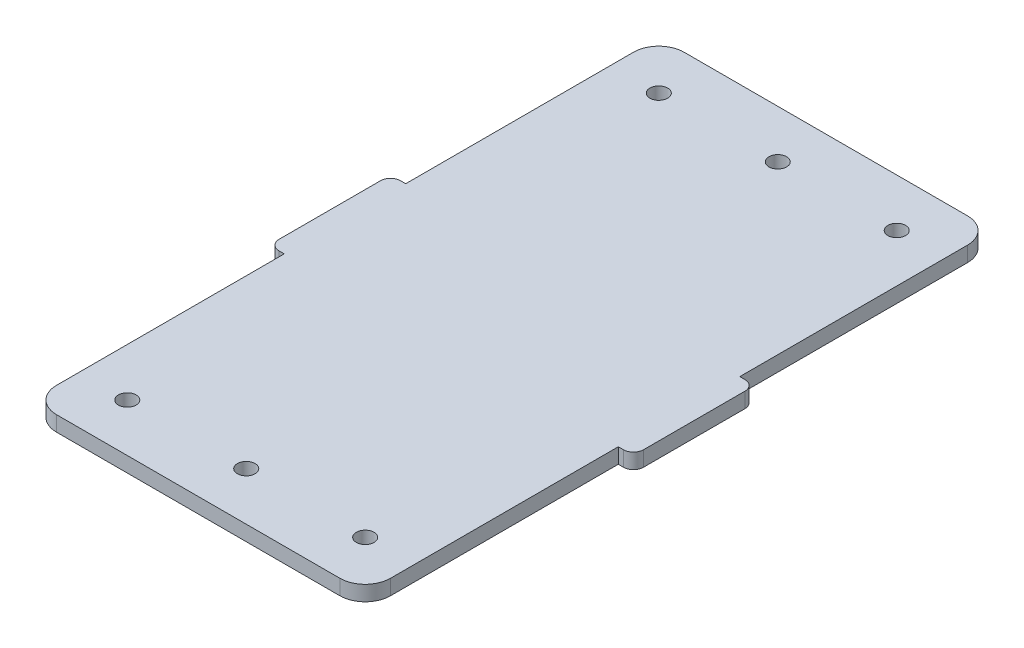
ISO-10303-21;
HEADER;
FILE_DESCRIPTION(('STEP AP214'),'2;1');
FILE_NAME('part.step','',(''),(''),'','','');
FILE_SCHEMA(('AUTOMOTIVE_DESIGN { 1 0 10303 214 1 1 1 1 }'));
ENDSEC;
DATA;
#1=APPLICATION_CONTEXT('core data for automotive mechanical design processes');
#2=APPLICATION_PROTOCOL_DEFINITION('international standard','automotive_design',2000,#1);
#3=PRODUCT_CONTEXT('',#1,'mechanical');
#4=PRODUCT('Part','Part','',(#3));
#5=PRODUCT_RELATED_PRODUCT_CATEGORY('part','',(#4));
#6=PRODUCT_DEFINITION_FORMATION('','',#4);
#7=PRODUCT_DEFINITION_CONTEXT('part definition',#1,'design');
#8=PRODUCT_DEFINITION('design','',#6,#7);
#9=PRODUCT_DEFINITION_SHAPE('','',#8);
#10=(LENGTH_UNIT() NAMED_UNIT(*) SI_UNIT(.MILLI.,.METRE.));
#11=(NAMED_UNIT(*) PLANE_ANGLE_UNIT() SI_UNIT($,.RADIAN.));
#12=(NAMED_UNIT(*) SI_UNIT($,.STERADIAN.) SOLID_ANGLE_UNIT());
#13=UNCERTAINTY_MEASURE_WITH_UNIT(LENGTH_MEASURE(1.E-05),#10,'distance_accuracy_value','');
#14=(GEOMETRIC_REPRESENTATION_CONTEXT(3) GLOBAL_UNCERTAINTY_ASSIGNED_CONTEXT((#13)) GLOBAL_UNIT_ASSIGNED_CONTEXT((#10,
#11,#12)) REPRESENTATION_CONTEXT('',''));
#15=CARTESIAN_POINT('',(0.,0.,0.));
#16=DIRECTION('',(0.,0.,1.));
#17=DIRECTION('',(1.,0.,0.));
#18=AXIS2_PLACEMENT_3D('',#15,#16,#17);
#19=CARTESIAN_POINT('',(36.,3.,-50.));
#20=DIRECTION('',(-1.,0.,0.));
#21=DIRECTION('',(0.,0.,1.));
#22=AXIS2_PLACEMENT_3D('',#19,#20,#21);
#23=PLANE('',#22);
#24=DIRECTION('',(0.,0.,-1.));
#25=VECTOR('',#24,1.);
#26=CARTESIAN_POINT('',(36.,3.,-50.));
#27=LINE('',#26,#25);
#28=CARTESIAN_POINT('',(36.,3.,22.));
#29=VERTEX_POINT('',#28);
#30=CARTESIAN_POINT('',(36.,3.,2.));
#31=VERTEX_POINT('',#30);
#32=EDGE_CURVE('E248',#29,#31,#27,.T.);
#33=ORIENTED_EDGE('',*,*,#32,.F.);
#34=DIRECTION('',(0.,1.,0.));
#35=VECTOR('',#34,1.);
#36=CARTESIAN_POINT('',(36.,3.,22.));
#37=LINE('',#36,#35);
#38=CARTESIAN_POINT('',(36.,0.,22.));
#39=VERTEX_POINT('',#38);
#40=EDGE_CURVE('E313',#29,#39,#37,.F.);
#41=ORIENTED_EDGE('',*,*,#40,.T.);
#42=DIRECTION('',(0.,0.,-1.));
#43=VECTOR('',#42,1.);
#44=CARTESIAN_POINT('',(36.,0.,-50.));
#45=LINE('',#44,#43);
#46=CARTESIAN_POINT('',(36.,0.,2.));
#47=VERTEX_POINT('',#46);
#48=EDGE_CURVE('E247',#39,#47,#45,.T.);
#49=ORIENTED_EDGE('',*,*,#48,.T.);
#50=DIRECTION('',(0.,1.,0.));
#51=VECTOR('',#50,1.);
#52=CARTESIAN_POINT('',(36.,3.,2.));
#53=LINE('',#52,#51);
#54=EDGE_CURVE('E310',#47,#31,#53,.T.);
#55=ORIENTED_EDGE('',*,*,#54,.T.);
#56=EDGE_LOOP('',(#33,#41,#49,#55));
#57=FACE_BOUND('',#56,.T.);
#58=ADVANCED_FACE('F33',(#57),#23,.F.);
#59=CARTESIAN_POINT('',(-36.,3.,-50.));
#60=DIRECTION('',(0.,0.,1.));
#61=DIRECTION('',(1.,0.,0.));
#62=AXIS2_PLACEMENT_3D('',#59,#60,#61);
#63=PLANE('',#62);
#64=DIRECTION('',(-1.,0.,0.));
#65=VECTOR('',#64,1.);
#66=CARTESIAN_POINT('',(-36.,3.,-50.));
#67=LINE('',#66,#65);
#68=CARTESIAN_POINT('',(28.,3.,-50.));
#69=VERTEX_POINT('',#68);
#70=CARTESIAN_POINT('',(-28.,3.,-50.));
#71=VERTEX_POINT('',#70);
#72=EDGE_CURVE('E251',#69,#71,#67,.T.);
#73=ORIENTED_EDGE('',*,*,#72,.F.);
#74=DIRECTION('',(0.,1.,0.));
#75=VECTOR('',#74,1.);
#76=CARTESIAN_POINT('',(28.,3.,-50.));
#77=LINE('',#76,#75);
#78=CARTESIAN_POINT('',(28.,0.,-50.));
#79=VERTEX_POINT('',#78);
#80=EDGE_CURVE('E296',#69,#79,#77,.F.);
#81=ORIENTED_EDGE('',*,*,#80,.T.);
#82=DIRECTION('',(-1.,0.,0.));
#83=VECTOR('',#82,1.);
#84=CARTESIAN_POINT('',(-36.,0.,-50.));
#85=LINE('',#84,#83);
#86=CARTESIAN_POINT('',(-28.,0.,-50.));
#87=VERTEX_POINT('',#86);
#88=EDGE_CURVE('E261',#79,#87,#85,.T.);
#89=ORIENTED_EDGE('',*,*,#88,.T.);
#90=DIRECTION('',(0.,1.,0.));
#91=VECTOR('',#90,1.);
#92=CARTESIAN_POINT('',(-28.,3.,-50.));
#93=LINE('',#92,#91);
#94=EDGE_CURVE('E293',#87,#71,#93,.T.);
#95=ORIENTED_EDGE('',*,*,#94,.T.);
#96=EDGE_LOOP('',(#73,#81,#89,#95));
#97=FACE_BOUND('',#96,.T.);
#98=ADVANCED_FACE('F362',(#97),#63,.F.);
#99=CARTESIAN_POINT('',(-36.,3.,-50.));
#100=DIRECTION('',(1.,0.,0.));
#101=DIRECTION('',(0.,0.,-1.));
#102=AXIS2_PLACEMENT_3D('',#99,#100,#101);
#103=PLANE('',#102);
#104=DIRECTION('',(0.,0.,1.));
#105=VECTOR('',#104,1.);
#106=CARTESIAN_POINT('',(-36.,0.,-50.));
#107=LINE('',#106,#105);
#108=CARTESIAN_POINT('',(-36.,0.,2.));
#109=VERTEX_POINT('',#108);
#110=CARTESIAN_POINT('',(-36.,0.,22.));
#111=VERTEX_POINT('',#110);
#112=EDGE_CURVE('E252',#109,#111,#107,.T.);
#113=ORIENTED_EDGE('',*,*,#112,.T.);
#114=DIRECTION('',(0.,1.,0.));
#115=VECTOR('',#114,1.);
#116=CARTESIAN_POINT('',(-36.,3.,22.));
#117=LINE('',#116,#115);
#118=CARTESIAN_POINT('',(-36.,3.,22.));
#119=VERTEX_POINT('',#118);
#120=EDGE_CURVE('E324',#111,#119,#117,.T.);
#121=ORIENTED_EDGE('',*,*,#120,.T.);
#122=DIRECTION('',(0.,0.,1.));
#123=VECTOR('',#122,1.);
#124=CARTESIAN_POINT('',(-36.,3.,-50.));
#125=LINE('',#124,#123);
#126=CARTESIAN_POINT('',(-36.,3.,2.));
#127=VERTEX_POINT('',#126);
#128=EDGE_CURVE('E255',#127,#119,#125,.T.);
#129=ORIENTED_EDGE('',*,*,#128,.F.);
#130=DIRECTION('',(0.,1.,0.));
#131=VECTOR('',#130,1.);
#132=CARTESIAN_POINT('',(-36.,3.,2.));
#133=LINE('',#132,#131);
#134=EDGE_CURVE('E322',#127,#109,#133,.F.);
#135=ORIENTED_EDGE('',*,*,#134,.T.);
#136=EDGE_LOOP('',(#113,#121,#129,#135));
#137=FACE_BOUND('',#136,.T.);
#138=ADVANCED_FACE('F339',(#137),#103,.F.);
#139=CARTESIAN_POINT('',(0.,3.,0.));
#140=DIRECTION('',(0.,1.,0.));
#141=DIRECTION('',(0.,0.,1.));
#142=AXIS2_PLACEMENT_3D('',#139,#140,#141);
#143=PLANE('',#142);
#144=CARTESIAN_POINT('',(0.,3.,-40.5));
#145=DIRECTION('',(0.,1.,0.));
#146=DIRECTION('',(0.,0.,1.));
#147=AXIS2_PLACEMENT_3D('',#144,#145,#146);
#148=CIRCLE('',#147,1.75);
#149=CARTESIAN_POINT('',(0.,3.,-38.75));
#150=VERTEX_POINT('',#149);
#151=EDGE_CURVE('E685',#150,#150,#148,.T.);
#152=ORIENTED_EDGE('',*,*,#151,.F.);
#153=EDGE_LOOP('',(#152));
#154=FACE_BOUND('',#153,.T.);
#155=CARTESIAN_POINT('',(0.,3.,64.5));
#156=DIRECTION('',(0.,1.,0.));
#157=DIRECTION('',(0.,0.,1.));
#158=AXIS2_PLACEMENT_3D('',#155,#156,#157);
#159=CIRCLE('',#158,1.75);
#160=CARTESIAN_POINT('',(0.,3.,66.25));
#161=VERTEX_POINT('',#160);
#162=EDGE_CURVE('E690',#161,#161,#159,.T.);
#163=ORIENTED_EDGE('',*,*,#162,.F.);
#164=EDGE_LOOP('',(#163));
#165=FACE_BOUND('',#164,.T.);
#166=CARTESIAN_POINT('',(23.5,3.,-40.5));
#167=DIRECTION('',(0.,1.,0.));
#168=DIRECTION('',(0.,0.,1.));
#169=AXIS2_PLACEMENT_3D('',#166,#167,#168);
#170=CIRCLE('',#169,1.75);
#171=CARTESIAN_POINT('',(23.5,3.,-38.75));
#172=VERTEX_POINT('',#171);
#173=EDGE_CURVE('E672',#172,#172,#170,.T.);
#174=ORIENTED_EDGE('',*,*,#173,.F.);
#175=EDGE_LOOP('',(#174));
#176=FACE_BOUND('',#175,.T.);
#177=CARTESIAN_POINT('',(-23.5,3.,64.5));
#178=DIRECTION('',(0.,1.,0.));
#179=DIRECTION('',(0.,0.,1.));
#180=AXIS2_PLACEMENT_3D('',#177,#178,#179);
#181=CIRCLE('',#180,1.75);
#182=CARTESIAN_POINT('',(-23.5,3.,66.25));
#183=VERTEX_POINT('',#182);
#184=EDGE_CURVE('E676',#183,#183,#181,.T.);
#185=ORIENTED_EDGE('',*,*,#184,.F.);
#186=EDGE_LOOP('',(#185));
#187=FACE_BOUND('',#186,.T.);
#188=CARTESIAN_POINT('',(23.5,3.,64.5));
#189=DIRECTION('',(0.,1.,0.));
#190=DIRECTION('',(0.,0.,1.));
#191=AXIS2_PLACEMENT_3D('',#188,#189,#190);
#192=CIRCLE('',#191,1.75);
#193=CARTESIAN_POINT('',(23.5,3.,66.25));
#194=VERTEX_POINT('',#193);
#195=EDGE_CURVE('E681',#194,#194,#192,.T.);
#196=ORIENTED_EDGE('',*,*,#195,.F.);
#197=EDGE_LOOP('',(#196));
#198=FACE_BOUND('',#197,.T.);
#199=CARTESIAN_POINT('',(-23.5,3.,-40.5));
#200=DIRECTION('',(0.,1.,0.));
#201=DIRECTION('',(0.,0.,1.));
#202=AXIS2_PLACEMENT_3D('',#199,#200,#201);
#203=CIRCLE('',#202,1.75);
#204=CARTESIAN_POINT('',(-23.5,3.,-38.75));
#205=VERTEX_POINT('',#204);
#206=EDGE_CURVE('E184',#205,#205,#203,.T.);
#207=ORIENTED_EDGE('',*,*,#206,.F.);
#208=EDGE_LOOP('',(#207));
#209=FACE_BOUND('',#208,.T.);
#210=DIRECTION('',(-1.,0.,0.));
#211=VECTOR('',#210,1.);
#212=CARTESIAN_POINT('',(0.,3.,24.));
#213=LINE('',#212,#211);
#214=CARTESIAN_POINT('',(34.,3.,24.));
#215=VERTEX_POINT('',#214);
#216=CARTESIAN_POINT('',(33.,3.,24.));
#217=VERTEX_POINT('',#216);
#218=EDGE_CURVE('E190',#215,#217,#213,.T.);
#219=ORIENTED_EDGE('',*,*,#218,.F.);
#220=CARTESIAN_POINT('',(34.,3.,22.));
#221=DIRECTION('',(0.,1.,0.));
#222=DIRECTION('',(0.,0.,1.));
#223=AXIS2_PLACEMENT_3D('',#220,#221,#222);
#224=CIRCLE('',#223,2.);
#225=EDGE_CURVE('E308',#215,#29,#224,.T.);
#226=ORIENTED_EDGE('',*,*,#225,.T.);
#227=ORIENTED_EDGE('',*,*,#32,.T.);
#228=CARTESIAN_POINT('',(34.,3.,2.));
#229=DIRECTION('',(0.,1.,0.));
#230=DIRECTION('',(0.,0.,1.));
#231=AXIS2_PLACEMENT_3D('',#228,#229,#230);
#232=CIRCLE('',#231,2.);
#233=CARTESIAN_POINT('',(34.,3.,0.));
#234=VERTEX_POINT('',#233);
#235=EDGE_CURVE('E306',#31,#234,#232,.T.);
#236=ORIENTED_EDGE('',*,*,#235,.T.);
#237=DIRECTION('',(1.,0.,0.));
#238=VECTOR('',#237,1.);
#239=CARTESIAN_POINT('',(0.,3.,0.));
#240=LINE('',#239,#238);
#241=CARTESIAN_POINT('',(33.,3.,0.));
#242=VERTEX_POINT('',#241);
#243=EDGE_CURVE('E239',#242,#234,#240,.T.);
#244=ORIENTED_EDGE('',*,*,#243,.F.);
#245=DIRECTION('',(0.,0.,1.));
#246=VECTOR('',#245,1.);
#247=CARTESIAN_POINT('',(33.,3.,0.));
#248=LINE('',#247,#246);
#249=CARTESIAN_POINT('',(33.,3.,-45.));
#250=VERTEX_POINT('',#249);
#251=EDGE_CURVE('E237',#250,#242,#248,.T.);
#252=ORIENTED_EDGE('',*,*,#251,.F.);
#253=CARTESIAN_POINT('',(28.,3.,-45.));
#254=DIRECTION('',(0.,1.,0.));
#255=DIRECTION('',(0.,0.,1.));
#256=AXIS2_PLACEMENT_3D('',#253,#254,#255);
#257=CIRCLE('',#256,5.);
#258=EDGE_CURVE('E270',#250,#69,#257,.T.);
#259=ORIENTED_EDGE('',*,*,#258,.T.);
#260=ORIENTED_EDGE('',*,*,#72,.T.);
#261=CARTESIAN_POINT('',(-28.,3.,-45.));
#262=DIRECTION('',(0.,1.,0.));
#263=DIRECTION('',(0.,0.,1.));
#264=AXIS2_PLACEMENT_3D('',#261,#262,#263);
#265=CIRCLE('',#264,5.);
#266=CARTESIAN_POINT('',(-33.,3.,-45.));
#267=VERTEX_POINT('',#266);
#268=EDGE_CURVE('E268',#71,#267,#265,.T.);
#269=ORIENTED_EDGE('',*,*,#268,.T.);
#270=DIRECTION('',(0.,0.,-1.));
#271=VECTOR('',#270,1.);
#272=CARTESIAN_POINT('',(-33.,3.,0.));
#273=LINE('',#272,#271);
#274=CARTESIAN_POINT('',(-33.,3.,0.));
#275=VERTEX_POINT('',#274);
#276=EDGE_CURVE('E230',#275,#267,#273,.T.);
#277=ORIENTED_EDGE('',*,*,#276,.F.);
#278=DIRECTION('',(1.,0.,0.));
#279=VECTOR('',#278,1.);
#280=CARTESIAN_POINT('',(0.,3.,0.));
#281=LINE('',#280,#279);
#282=CARTESIAN_POINT('',(-34.,3.,0.));
#283=VERTEX_POINT('',#282);
#284=EDGE_CURVE('E228',#283,#275,#281,.T.);
#285=ORIENTED_EDGE('',*,*,#284,.F.);
#286=CARTESIAN_POINT('',(-34.,3.,2.));
#287=DIRECTION('',(0.,1.,0.));
#288=DIRECTION('',(0.,0.,1.));
#289=AXIS2_PLACEMENT_3D('',#286,#287,#288);
#290=CIRCLE('',#289,2.);
#291=EDGE_CURVE('E302',#283,#127,#290,.T.);
#292=ORIENTED_EDGE('',*,*,#291,.T.);
#293=ORIENTED_EDGE('',*,*,#128,.T.);
#294=CARTESIAN_POINT('',(-34.,3.,22.));
#295=DIRECTION('',(0.,1.,0.));
#296=DIRECTION('',(0.,0.,1.));
#297=AXIS2_PLACEMENT_3D('',#294,#295,#296);
#298=CIRCLE('',#297,2.);
#299=CARTESIAN_POINT('',(-34.,3.,24.));
#300=VERTEX_POINT('',#299);
#301=EDGE_CURVE('E304',#119,#300,#298,.T.);
#302=ORIENTED_EDGE('',*,*,#301,.T.);
#303=DIRECTION('',(-1.,0.,0.));
#304=VECTOR('',#303,1.);
#305=CARTESIAN_POINT('',(0.,3.,24.));
#306=LINE('',#305,#304);
#307=CARTESIAN_POINT('',(-33.,3.,24.));
#308=VERTEX_POINT('',#307);
#309=EDGE_CURVE('E234',#308,#300,#306,.T.);
#310=ORIENTED_EDGE('',*,*,#309,.F.);
#311=DIRECTION('',(0.,0.,-1.));
#312=VECTOR('',#311,1.);
#313=CARTESIAN_POINT('',(-33.,3.,0.));
#314=LINE('',#313,#312);
#315=CARTESIAN_POINT('',(-33.,3.,69.));
#316=VERTEX_POINT('',#315);
#317=EDGE_CURVE('E226',#316,#308,#314,.T.);
#318=ORIENTED_EDGE('',*,*,#317,.F.);
#319=CARTESIAN_POINT('',(-28.,3.,69.));
#320=DIRECTION('',(0.,1.,0.));
#321=DIRECTION('',(0.,0.,1.));
#322=AXIS2_PLACEMENT_3D('',#319,#320,#321);
#323=CIRCLE('',#322,5.);
#324=CARTESIAN_POINT('',(-28.,3.,74.));
#325=VERTEX_POINT('',#324);
#326=EDGE_CURVE('E274',#316,#325,#323,.T.);
#327=ORIENTED_EDGE('',*,*,#326,.T.);
#328=DIRECTION('',(-1.,0.,0.));
#329=VECTOR('',#328,1.);
#330=CARTESIAN_POINT('',(36.,3.,74.));
#331=LINE('',#330,#329);
#332=CARTESIAN_POINT('',(28.,3.,74.));
#333=VERTEX_POINT('',#332);
#334=EDGE_CURVE('E244',#333,#325,#331,.T.);
#335=ORIENTED_EDGE('',*,*,#334,.F.);
#336=CARTESIAN_POINT('',(28.,3.,69.));
#337=DIRECTION('',(0.,1.,0.));
#338=DIRECTION('',(0.,0.,1.));
#339=AXIS2_PLACEMENT_3D('',#336,#337,#338);
#340=CIRCLE('',#339,5.);
#341=CARTESIAN_POINT('',(33.,3.,69.));
#342=VERTEX_POINT('',#341);
#343=EDGE_CURVE('E272',#333,#342,#340,.T.);
#344=ORIENTED_EDGE('',*,*,#343,.T.);
#345=DIRECTION('',(0.,0.,1.));
#346=VECTOR('',#345,1.);
#347=CARTESIAN_POINT('',(33.,3.,0.));
#348=LINE('',#347,#346);
#349=EDGE_CURVE('E224',#217,#342,#348,.T.);
#350=ORIENTED_EDGE('',*,*,#349,.F.);
#351=EDGE_LOOP('',(#219,#226,#227,#236,#244,#252,#259,#260,#269,#277,#285,#292,#293,#302,#310,
#318,#327,#335,#344,#350));
#352=FACE_BOUND('',#351,.T.);
#353=ADVANCED_FACE('F342',(#154,#165,#176,#187,#198,#209,#352),#143,.T.);
#354=CARTESIAN_POINT('',(0.,0.,0.));
#355=DIRECTION('',(0.,1.,0.));
#356=DIRECTION('',(0.,0.,1.));
#357=AXIS2_PLACEMENT_3D('',#354,#355,#356);
#358=PLANE('',#357);
#359=CARTESIAN_POINT('',(0.,0.,-40.5));
#360=DIRECTION('',(0.,1.,0.));
#361=DIRECTION('',(0.,0.,1.));
#362=AXIS2_PLACEMENT_3D('',#359,#360,#361);
#363=CIRCLE('',#362,1.75);
#364=CARTESIAN_POINT('',(0.,0.,-38.75));
#365=VERTEX_POINT('',#364);
#366=EDGE_CURVE('E651',#365,#365,#363,.T.);
#367=ORIENTED_EDGE('',*,*,#366,.T.);
#368=EDGE_LOOP('',(#367));
#369=FACE_BOUND('',#368,.T.);
#370=CARTESIAN_POINT('',(0.,0.,64.5));
#371=DIRECTION('',(0.,1.,0.));
#372=DIRECTION('',(0.,0.,1.));
#373=AXIS2_PLACEMENT_3D('',#370,#371,#372);
#374=CIRCLE('',#373,1.75);
#375=CARTESIAN_POINT('',(0.,0.,66.25));
#376=VERTEX_POINT('',#375);
#377=EDGE_CURVE('E655',#376,#376,#374,.T.);
#378=ORIENTED_EDGE('',*,*,#377,.T.);
#379=EDGE_LOOP('',(#378));
#380=FACE_BOUND('',#379,.T.);
#381=CARTESIAN_POINT('',(23.5,0.,-40.5));
#382=DIRECTION('',(0.,1.,0.));
#383=DIRECTION('',(0.,0.,1.));
#384=AXIS2_PLACEMENT_3D('',#381,#382,#383);
#385=CIRCLE('',#384,1.75);
#386=CARTESIAN_POINT('',(23.5,0.,-38.75));
#387=VERTEX_POINT('',#386);
#388=EDGE_CURVE('E659',#387,#387,#385,.T.);
#389=ORIENTED_EDGE('',*,*,#388,.T.);
#390=EDGE_LOOP('',(#389));
#391=FACE_BOUND('',#390,.T.);
#392=CARTESIAN_POINT('',(-23.5,0.,64.5));
#393=DIRECTION('',(0.,1.,0.));
#394=DIRECTION('',(0.,0.,1.));
#395=AXIS2_PLACEMENT_3D('',#392,#393,#394);
#396=CIRCLE('',#395,1.75);
#397=CARTESIAN_POINT('',(-23.5,0.,66.25));
#398=VERTEX_POINT('',#397);
#399=EDGE_CURVE('E663',#398,#398,#396,.T.);
#400=ORIENTED_EDGE('',*,*,#399,.T.);
#401=EDGE_LOOP('',(#400));
#402=FACE_BOUND('',#401,.T.);
#403=CARTESIAN_POINT('',(23.5,0.,64.5));
#404=DIRECTION('',(0.,1.,0.));
#405=DIRECTION('',(0.,0.,1.));
#406=AXIS2_PLACEMENT_3D('',#403,#404,#405);
#407=CIRCLE('',#406,1.75);
#408=CARTESIAN_POINT('',(23.5,0.,66.25));
#409=VERTEX_POINT('',#408);
#410=EDGE_CURVE('E667',#409,#409,#407,.T.);
#411=ORIENTED_EDGE('',*,*,#410,.T.);
#412=EDGE_LOOP('',(#411));
#413=FACE_BOUND('',#412,.T.);
#414=CARTESIAN_POINT('',(-23.5,0.,-40.5));
#415=DIRECTION('',(0.,1.,0.));
#416=DIRECTION('',(0.,0.,1.));
#417=AXIS2_PLACEMENT_3D('',#414,#415,#416);
#418=CIRCLE('',#417,1.75);
#419=CARTESIAN_POINT('',(-23.5,0.,-38.75));
#420=VERTEX_POINT('',#419);
#421=EDGE_CURVE('E670',#420,#420,#418,.T.);
#422=ORIENTED_EDGE('',*,*,#421,.T.);
#423=EDGE_LOOP('',(#422));
#424=FACE_BOUND('',#423,.T.);
#425=ORIENTED_EDGE('',*,*,#48,.F.);
#426=CARTESIAN_POINT('',(34.,0.,22.));
#427=DIRECTION('',(0.,1.,0.));
#428=DIRECTION('',(0.,0.,1.));
#429=AXIS2_PLACEMENT_3D('',#426,#427,#428);
#430=CIRCLE('',#429,2.);
#431=CARTESIAN_POINT('',(34.,0.,24.));
#432=VERTEX_POINT('',#431);
#433=EDGE_CURVE('E180',#39,#432,#430,.F.);
#434=ORIENTED_EDGE('',*,*,#433,.T.);
#435=DIRECTION('',(-1.,0.,0.));
#436=VECTOR('',#435,1.);
#437=CARTESIAN_POINT('',(36.,0.,24.));
#438=LINE('',#437,#436);
#439=CARTESIAN_POINT('',(33.,0.,24.));
#440=VERTEX_POINT('',#439);
#441=EDGE_CURVE('E172',#432,#440,#438,.T.);
#442=ORIENTED_EDGE('',*,*,#441,.T.);
#443=DIRECTION('',(0.,0.,1.));
#444=VECTOR('',#443,1.);
#445=CARTESIAN_POINT('',(33.,0.,74.));
#446=LINE('',#445,#444);
#447=CARTESIAN_POINT('',(33.,0.,69.));
#448=VERTEX_POINT('',#447);
#449=EDGE_CURVE('E177',#440,#448,#446,.T.);
#450=ORIENTED_EDGE('',*,*,#449,.T.);
#451=CARTESIAN_POINT('',(28.,0.,69.));
#452=DIRECTION('',(0.,1.,0.));
#453=DIRECTION('',(0.,0.,1.));
#454=AXIS2_PLACEMENT_3D('',#451,#452,#453);
#455=CIRCLE('',#454,5.);
#456=CARTESIAN_POINT('',(28.,0.,74.));
#457=VERTEX_POINT('',#456);
#458=EDGE_CURVE('E285',#448,#457,#455,.F.);
#459=ORIENTED_EDGE('',*,*,#458,.T.);
#460=DIRECTION('',(1.,0.,0.));
#461=VECTOR('',#460,1.);
#462=CARTESIAN_POINT('',(-36.,0.,74.));
#463=LINE('',#462,#461);
#464=CARTESIAN_POINT('',(-28.,0.,74.));
#465=VERTEX_POINT('',#464);
#466=EDGE_CURVE('E241',#465,#457,#463,.T.);
#467=ORIENTED_EDGE('',*,*,#466,.F.);
#468=CARTESIAN_POINT('',(-28.,0.,69.));
#469=DIRECTION('',(0.,1.,0.));
#470=DIRECTION('',(0.,0.,1.));
#471=AXIS2_PLACEMENT_3D('',#468,#469,#470);
#472=CIRCLE('',#471,5.);
#473=CARTESIAN_POINT('',(-33.,0.,69.));
#474=VERTEX_POINT('',#473);
#475=EDGE_CURVE('E287',#465,#474,#472,.F.);
#476=ORIENTED_EDGE('',*,*,#475,.T.);
#477=DIRECTION('',(0.,0.,-1.));
#478=VECTOR('',#477,1.);
#479=CARTESIAN_POINT('',(-33.,0.,74.));
#480=LINE('',#479,#478);
#481=CARTESIAN_POINT('',(-33.,0.,24.));
#482=VERTEX_POINT('',#481);
#483=EDGE_CURVE('E194',#474,#482,#480,.T.);
#484=ORIENTED_EDGE('',*,*,#483,.T.);
#485=DIRECTION('',(-1.,0.,0.));
#486=VECTOR('',#485,1.);
#487=CARTESIAN_POINT('',(-36.,0.,24.));
#488=LINE('',#487,#486);
#489=CARTESIAN_POINT('',(-34.,0.,24.));
#490=VERTEX_POINT('',#489);
#491=EDGE_CURVE('E212',#482,#490,#488,.T.);
#492=ORIENTED_EDGE('',*,*,#491,.T.);
#493=CARTESIAN_POINT('',(-34.,0.,22.));
#494=DIRECTION('',(0.,1.,0.));
#495=DIRECTION('',(0.,0.,1.));
#496=AXIS2_PLACEMENT_3D('',#493,#494,#495);
#497=CIRCLE('',#496,2.);
#498=EDGE_CURVE('E316',#490,#111,#497,.F.);
#499=ORIENTED_EDGE('',*,*,#498,.T.);
#500=ORIENTED_EDGE('',*,*,#112,.F.);
#501=CARTESIAN_POINT('',(-34.,0.,2.));
#502=DIRECTION('',(0.,1.,0.));
#503=DIRECTION('',(0.,0.,1.));
#504=AXIS2_PLACEMENT_3D('',#501,#502,#503);
#505=CIRCLE('',#504,2.);
#506=CARTESIAN_POINT('',(-34.,0.,0.));
#507=VERTEX_POINT('',#506);
#508=EDGE_CURVE('E56',#109,#507,#505,.F.);
#509=ORIENTED_EDGE('',*,*,#508,.T.);
#510=DIRECTION('',(1.,0.,0.));
#511=VECTOR('',#510,1.);
#512=CARTESIAN_POINT('',(-36.,0.,0.));
#513=LINE('',#512,#511);
#514=CARTESIAN_POINT('',(-33.,0.,0.));
#515=VERTEX_POINT('',#514);
#516=EDGE_CURVE('E210',#507,#515,#513,.T.);
#517=ORIENTED_EDGE('',*,*,#516,.T.);
#518=DIRECTION('',(0.,0.,-1.));
#519=VECTOR('',#518,1.);
#520=CARTESIAN_POINT('',(-33.,0.,-50.));
#521=LINE('',#520,#519);
#522=CARTESIAN_POINT('',(-33.,0.,-45.));
#523=VERTEX_POINT('',#522);
#524=EDGE_CURVE('E218',#515,#523,#521,.T.);
#525=ORIENTED_EDGE('',*,*,#524,.T.);
#526=CARTESIAN_POINT('',(-28.,0.,-45.));
#527=DIRECTION('',(0.,1.,0.));
#528=DIRECTION('',(0.,0.,1.));
#529=AXIS2_PLACEMENT_3D('',#526,#527,#528);
#530=CIRCLE('',#529,5.);
#531=EDGE_CURVE('E281',#523,#87,#530,.F.);
#532=ORIENTED_EDGE('',*,*,#531,.T.);
#533=ORIENTED_EDGE('',*,*,#88,.F.);
#534=CARTESIAN_POINT('',(28.,0.,-45.));
#535=DIRECTION('',(0.,1.,0.));
#536=DIRECTION('',(0.,0.,1.));
#537=AXIS2_PLACEMENT_3D('',#534,#535,#536);
#538=CIRCLE('',#537,5.);
#539=CARTESIAN_POINT('',(33.,0.,-45.));
#540=VERTEX_POINT('',#539);
#541=EDGE_CURVE('E283',#79,#540,#538,.F.);
#542=ORIENTED_EDGE('',*,*,#541,.T.);
#543=DIRECTION('',(0.,0.,1.));
#544=VECTOR('',#543,1.);
#545=CARTESIAN_POINT('',(33.,0.,-50.));
#546=LINE('',#545,#544);
#547=CARTESIAN_POINT('',(33.,0.,0.));
#548=VERTEX_POINT('',#547);
#549=EDGE_CURVE('E202',#540,#548,#546,.T.);
#550=ORIENTED_EDGE('',*,*,#549,.T.);
#551=DIRECTION('',(1.,0.,0.));
#552=VECTOR('',#551,1.);
#553=CARTESIAN_POINT('',(36.,0.,0.));
#554=LINE('',#553,#552);
#555=CARTESIAN_POINT('',(34.,0.,0.));
#556=VERTEX_POINT('',#555);
#557=EDGE_CURVE('E204',#548,#556,#554,.T.);
#558=ORIENTED_EDGE('',*,*,#557,.T.);
#559=CARTESIAN_POINT('',(34.,0.,2.));
#560=DIRECTION('',(0.,1.,0.));
#561=DIRECTION('',(0.,0.,1.));
#562=AXIS2_PLACEMENT_3D('',#559,#560,#561);
#563=CIRCLE('',#562,2.);
#564=EDGE_CURVE('E318',#556,#47,#563,.F.);
#565=ORIENTED_EDGE('',*,*,#564,.T.);
#566=EDGE_LOOP('',(#425,#434,#442,#450,#459,#467,#476,#484,#492,#499,#500,#509,#517,#525,#532,
#533,#542,#550,#558,#565));
#567=FACE_BOUND('',#566,.T.);
#568=ADVANCED_FACE('F175',(#369,#380,#391,#402,#413,#424,#567),#358,.F.);
#569=CARTESIAN_POINT('',(0.,0.,74.));
#570=DIRECTION('',(0.,0.,1.));
#571=DIRECTION('',(1.,0.,0.));
#572=AXIS2_PLACEMENT_3D('',#569,#570,#571);
#573=PLANE('',#572);
#574=ORIENTED_EDGE('',*,*,#334,.T.);
#575=DIRECTION('',(0.,1.,0.));
#576=VECTOR('',#575,1.);
#577=CARTESIAN_POINT('',(-28.,0.,74.));
#578=LINE('',#577,#576);
#579=EDGE_CURVE('E279',#325,#465,#578,.F.);
#580=ORIENTED_EDGE('',*,*,#579,.T.);
#581=ORIENTED_EDGE('',*,*,#466,.T.);
#582=DIRECTION('',(0.,1.,0.));
#583=VECTOR('',#582,1.);
#584=CARTESIAN_POINT('',(28.,3.,74.));
#585=LINE('',#584,#583);
#586=EDGE_CURVE('E276',#457,#333,#585,.T.);
#587=ORIENTED_EDGE('',*,*,#586,.T.);
#588=EDGE_LOOP('',(#574,#580,#581,#587));
#589=FACE_BOUND('',#588,.T.);
#590=ADVANCED_FACE('F390',(#589),#573,.T.);
#591=CARTESIAN_POINT('',(33.,0.,74.));
#592=DIRECTION('',(-1.,0.,0.));
#593=DIRECTION('',(0.,0.,1.));
#594=AXIS2_PLACEMENT_3D('',#591,#592,#593);
#595=PLANE('',#594);
#596=ORIENTED_EDGE('',*,*,#349,.T.);
#597=DIRECTION('',(0.,1.,0.));
#598=VECTOR('',#597,1.);
#599=CARTESIAN_POINT('',(33.,0.,69.));
#600=LINE('',#599,#598);
#601=EDGE_CURVE('E198',#342,#448,#600,.F.);
#602=ORIENTED_EDGE('',*,*,#601,.T.);
#603=ORIENTED_EDGE('',*,*,#449,.F.);
#604=DIRECTION('',(0.,1.,0.));
#605=VECTOR('',#604,1.);
#606=CARTESIAN_POINT('',(33.,0.,24.));
#607=LINE('',#606,#605);
#608=EDGE_CURVE('E187',#440,#217,#607,.T.);
#609=ORIENTED_EDGE('',*,*,#608,.T.);
#610=EDGE_LOOP('',(#596,#602,#603,#609));
#611=FACE_BOUND('',#610,.T.);
#612=ADVANCED_FACE('F196',(#611),#595,.F.);
#613=CARTESIAN_POINT('',(36.,0.,24.));
#614=DIRECTION('',(0.,0.,-1.));
#615=DIRECTION('',(-1.,0.,0.));
#616=AXIS2_PLACEMENT_3D('',#613,#614,#615);
#617=PLANE('',#616);
#618=ORIENTED_EDGE('',*,*,#441,.F.);
#619=DIRECTION('',(0.,1.,0.));
#620=VECTOR('',#619,1.);
#621=CARTESIAN_POINT('',(34.,0.,24.));
#622=LINE('',#621,#620);
#623=EDGE_CURVE('E300',#432,#215,#622,.T.);
#624=ORIENTED_EDGE('',*,*,#623,.T.);
#625=ORIENTED_EDGE('',*,*,#218,.T.);
#626=ORIENTED_EDGE('',*,*,#608,.F.);
#627=EDGE_LOOP('',(#618,#624,#625,#626));
#628=FACE_BOUND('',#627,.T.);
#629=ADVANCED_FACE('F188',(#628),#617,.F.);
#630=CARTESIAN_POINT('',(-36.,0.,24.));
#631=DIRECTION('',(0.,0.,-1.));
#632=DIRECTION('',(-1.,0.,0.));
#633=AXIS2_PLACEMENT_3D('',#630,#631,#632);
#634=PLANE('',#633);
#635=ORIENTED_EDGE('',*,*,#309,.T.);
#636=DIRECTION('',(0.,1.,0.));
#637=VECTOR('',#636,1.);
#638=CARTESIAN_POINT('',(-34.,0.,24.));
#639=LINE('',#638,#637);
#640=EDGE_CURVE('E41',#300,#490,#639,.F.);
#641=ORIENTED_EDGE('',*,*,#640,.T.);
#642=ORIENTED_EDGE('',*,*,#491,.F.);
#643=DIRECTION('',(0.,1.,0.));
#644=VECTOR('',#643,1.);
#645=CARTESIAN_POINT('',(-33.,0.,24.));
#646=LINE('',#645,#644);
#647=EDGE_CURVE('E205',#482,#308,#646,.T.);
#648=ORIENTED_EDGE('',*,*,#647,.T.);
#649=EDGE_LOOP('',(#635,#641,#642,#648));
#650=FACE_BOUND('',#649,.T.);
#651=ADVANCED_FACE('F329',(#650),#634,.F.);
#652=CARTESIAN_POINT('',(-33.,0.,74.));
#653=DIRECTION('',(1.,0.,0.));
#654=DIRECTION('',(0.,0.,-1.));
#655=AXIS2_PLACEMENT_3D('',#652,#653,#654);
#656=PLANE('',#655);
#657=ORIENTED_EDGE('',*,*,#483,.F.);
#658=DIRECTION('',(0.,1.,0.));
#659=VECTOR('',#658,1.);
#660=CARTESIAN_POINT('',(-33.,3.,69.));
#661=LINE('',#660,#659);
#662=EDGE_CURVE('E258',#474,#316,#661,.T.);
#663=ORIENTED_EDGE('',*,*,#662,.T.);
#664=ORIENTED_EDGE('',*,*,#317,.T.);
#665=ORIENTED_EDGE('',*,*,#647,.F.);
#666=EDGE_LOOP('',(#657,#663,#664,#665));
#667=FACE_BOUND('',#666,.T.);
#668=ADVANCED_FACE('F396',(#667),#656,.F.);
#669=CARTESIAN_POINT('',(-33.,0.,-50.));
#670=DIRECTION('',(1.,0.,0.));
#671=DIRECTION('',(0.,0.,-1.));
#672=AXIS2_PLACEMENT_3D('',#669,#670,#671);
#673=PLANE('',#672);
#674=ORIENTED_EDGE('',*,*,#276,.T.);
#675=DIRECTION('',(0.,1.,0.));
#676=VECTOR('',#675,1.);
#677=CARTESIAN_POINT('',(-33.,0.,-45.));
#678=LINE('',#677,#676);
#679=EDGE_CURVE('E298',#267,#523,#678,.F.);
#680=ORIENTED_EDGE('',*,*,#679,.T.);
#681=ORIENTED_EDGE('',*,*,#524,.F.);
#682=DIRECTION('',(0.,1.,0.));
#683=VECTOR('',#682,1.);
#684=CARTESIAN_POINT('',(-33.,0.,0.));
#685=LINE('',#684,#683);
#686=EDGE_CURVE('E221',#515,#275,#685,.T.);
#687=ORIENTED_EDGE('',*,*,#686,.T.);
#688=EDGE_LOOP('',(#674,#680,#681,#687));
#689=FACE_BOUND('',#688,.T.);
#690=ADVANCED_FACE('F353',(#689),#673,.F.);
#691=CARTESIAN_POINT('',(-36.,0.,0.));
#692=DIRECTION('',(0.,0.,1.));
#693=DIRECTION('',(1.,0.,0.));
#694=AXIS2_PLACEMENT_3D('',#691,#692,#693);
#695=PLANE('',#694);
#696=ORIENTED_EDGE('',*,*,#516,.F.);
#697=DIRECTION('',(0.,1.,0.));
#698=VECTOR('',#697,1.);
#699=CARTESIAN_POINT('',(-34.,0.,0.));
#700=LINE('',#699,#698);
#701=EDGE_CURVE('E11',#507,#283,#700,.T.);
#702=ORIENTED_EDGE('',*,*,#701,.T.);
#703=ORIENTED_EDGE('',*,*,#284,.T.);
#704=ORIENTED_EDGE('',*,*,#686,.F.);
#705=EDGE_LOOP('',(#696,#702,#703,#704));
#706=FACE_BOUND('',#705,.T.);
#707=ADVANCED_FACE('F348',(#706),#695,.F.);
#708=CARTESIAN_POINT('',(36.,0.,0.));
#709=DIRECTION('',(0.,0.,1.));
#710=DIRECTION('',(1.,0.,0.));
#711=AXIS2_PLACEMENT_3D('',#708,#709,#710);
#712=PLANE('',#711);
#713=ORIENTED_EDGE('',*,*,#243,.T.);
#714=DIRECTION('',(0.,1.,0.));
#715=VECTOR('',#714,1.);
#716=CARTESIAN_POINT('',(34.,0.,0.));
#717=LINE('',#716,#715);
#718=EDGE_CURVE('E48',#234,#556,#717,.F.);
#719=ORIENTED_EDGE('',*,*,#718,.T.);
#720=ORIENTED_EDGE('',*,*,#557,.F.);
#721=DIRECTION('',(0.,1.,0.));
#722=VECTOR('',#721,1.);
#723=CARTESIAN_POINT('',(33.,0.,0.));
#724=LINE('',#723,#722);
#725=EDGE_CURVE('E207',#548,#242,#724,.T.);
#726=ORIENTED_EDGE('',*,*,#725,.T.);
#727=EDGE_LOOP('',(#713,#719,#720,#726));
#728=FACE_BOUND('',#727,.T.);
#729=ADVANCED_FACE('F373',(#728),#712,.F.);
#730=CARTESIAN_POINT('',(33.,0.,-50.));
#731=DIRECTION('',(-1.,0.,0.));
#732=DIRECTION('',(0.,0.,1.));
#733=AXIS2_PLACEMENT_3D('',#730,#731,#732);
#734=PLANE('',#733);
#735=ORIENTED_EDGE('',*,*,#549,.F.);
#736=DIRECTION('',(0.,1.,0.));
#737=VECTOR('',#736,1.);
#738=CARTESIAN_POINT('',(33.,0.,-45.));
#739=LINE('',#738,#737);
#740=EDGE_CURVE('E290',#540,#250,#739,.T.);
#741=ORIENTED_EDGE('',*,*,#740,.T.);
#742=ORIENTED_EDGE('',*,*,#251,.T.);
#743=ORIENTED_EDGE('',*,*,#725,.F.);
#744=EDGE_LOOP('',(#735,#741,#742,#743));
#745=FACE_BOUND('',#744,.T.);
#746=ADVANCED_FACE('F370',(#745),#734,.F.);
#747=CARTESIAN_POINT('',(-23.5,0.,-40.5));
#748=DIRECTION('',(0.,1.,0.));
#749=DIRECTION('',(0.,0.,1.));
#750=AXIS2_PLACEMENT_3D('',#747,#748,#749);
#751=CYLINDRICAL_SURFACE('',#750,1.75);
#752=ORIENTED_EDGE('',*,*,#206,.T.);
#753=EDGE_LOOP('',(#752));
#754=FACE_BOUND('',#753,.T.);
#755=ORIENTED_EDGE('',*,*,#421,.F.);
#756=EDGE_LOOP('',(#755));
#757=FACE_BOUND('',#756,.T.);
#758=ADVANCED_FACE('F455',(#754,#757),#751,.F.);
#759=CARTESIAN_POINT('',(23.5,0.,64.5));
#760=DIRECTION('',(0.,1.,0.));
#761=DIRECTION('',(0.,0.,1.));
#762=AXIS2_PLACEMENT_3D('',#759,#760,#761);
#763=CYLINDRICAL_SURFACE('',#762,1.75);
#764=ORIENTED_EDGE('',*,*,#195,.T.);
#765=EDGE_LOOP('',(#764));
#766=FACE_BOUND('',#765,.T.);
#767=ORIENTED_EDGE('',*,*,#410,.F.);
#768=EDGE_LOOP('',(#767));
#769=FACE_BOUND('',#768,.T.);
#770=ADVANCED_FACE('F451',(#766,#769),#763,.F.);
#771=CARTESIAN_POINT('',(-23.5,0.,64.5));
#772=DIRECTION('',(0.,1.,0.));
#773=DIRECTION('',(0.,0.,1.));
#774=AXIS2_PLACEMENT_3D('',#771,#772,#773);
#775=CYLINDRICAL_SURFACE('',#774,1.75);
#776=ORIENTED_EDGE('',*,*,#184,.T.);
#777=EDGE_LOOP('',(#776));
#778=FACE_BOUND('',#777,.T.);
#779=ORIENTED_EDGE('',*,*,#399,.F.);
#780=EDGE_LOOP('',(#779));
#781=FACE_BOUND('',#780,.T.);
#782=ADVANCED_FACE('F447',(#778,#781),#775,.F.);
#783=CARTESIAN_POINT('',(23.5,0.,-40.5));
#784=DIRECTION('',(0.,1.,0.));
#785=DIRECTION('',(0.,0.,1.));
#786=AXIS2_PLACEMENT_3D('',#783,#784,#785);
#787=CYLINDRICAL_SURFACE('',#786,1.75);
#788=ORIENTED_EDGE('',*,*,#173,.T.);
#789=EDGE_LOOP('',(#788));
#790=FACE_BOUND('',#789,.T.);
#791=ORIENTED_EDGE('',*,*,#388,.F.);
#792=EDGE_LOOP('',(#791));
#793=FACE_BOUND('',#792,.T.);
#794=ADVANCED_FACE('F416',(#790,#793),#787,.F.);
#795=CARTESIAN_POINT('',(-28.,0.,69.));
#796=DIRECTION('',(0.,-1.,0.));
#797=DIRECTION('',(0.,0.,-1.));
#798=AXIS2_PLACEMENT_3D('',#795,#796,#797);
#799=CYLINDRICAL_SURFACE('',#798,5.);
#800=ORIENTED_EDGE('',*,*,#475,.F.);
#801=ORIENTED_EDGE('',*,*,#579,.F.);
#802=ORIENTED_EDGE('',*,*,#326,.F.);
#803=ORIENTED_EDGE('',*,*,#662,.F.);
#804=EDGE_LOOP('',(#800,#801,#802,#803));
#805=FACE_BOUND('',#804,.T.);
#806=ADVANCED_FACE('F393',(#805),#799,.T.);
#807=CARTESIAN_POINT('',(28.,0.,69.));
#808=DIRECTION('',(0.,-1.,0.));
#809=DIRECTION('',(0.,0.,-1.));
#810=AXIS2_PLACEMENT_3D('',#807,#808,#809);
#811=CYLINDRICAL_SURFACE('',#810,5.);
#812=ORIENTED_EDGE('',*,*,#458,.F.);
#813=ORIENTED_EDGE('',*,*,#601,.F.);
#814=ORIENTED_EDGE('',*,*,#343,.F.);
#815=ORIENTED_EDGE('',*,*,#586,.F.);
#816=EDGE_LOOP('',(#812,#813,#814,#815));
#817=FACE_BOUND('',#816,.T.);
#818=ADVANCED_FACE('F385',(#817),#811,.T.);
#819=CARTESIAN_POINT('',(28.,0.,-45.));
#820=DIRECTION('',(0.,1.,0.));
#821=DIRECTION('',(0.,0.,1.));
#822=AXIS2_PLACEMENT_3D('',#819,#820,#821);
#823=CYLINDRICAL_SURFACE('',#822,5.);
#824=ORIENTED_EDGE('',*,*,#541,.F.);
#825=ORIENTED_EDGE('',*,*,#80,.F.);
#826=ORIENTED_EDGE('',*,*,#258,.F.);
#827=ORIENTED_EDGE('',*,*,#740,.F.);
#828=EDGE_LOOP('',(#824,#825,#826,#827));
#829=FACE_BOUND('',#828,.T.);
#830=ADVANCED_FACE('F365',(#829),#823,.T.);
#831=CARTESIAN_POINT('',(-28.,3.,-45.));
#832=DIRECTION('',(0.,1.,0.));
#833=DIRECTION('',(0.,0.,1.));
#834=AXIS2_PLACEMENT_3D('',#831,#832,#833);
#835=CYLINDRICAL_SURFACE('',#834,5.);
#836=ORIENTED_EDGE('',*,*,#531,.F.);
#837=ORIENTED_EDGE('',*,*,#679,.F.);
#838=ORIENTED_EDGE('',*,*,#268,.F.);
#839=ORIENTED_EDGE('',*,*,#94,.F.);
#840=EDGE_LOOP('',(#836,#837,#838,#839));
#841=FACE_BOUND('',#840,.T.);
#842=ADVANCED_FACE('F356',(#841),#835,.T.);
#843=CARTESIAN_POINT('',(34.,0.,22.));
#844=DIRECTION('',(0.,1.,0.));
#845=DIRECTION('',(0.,0.,1.));
#846=AXIS2_PLACEMENT_3D('',#843,#844,#845);
#847=CYLINDRICAL_SURFACE('',#846,2.);
#848=ORIENTED_EDGE('',*,*,#433,.F.);
#849=ORIENTED_EDGE('',*,*,#40,.F.);
#850=ORIENTED_EDGE('',*,*,#225,.F.);
#851=ORIENTED_EDGE('',*,*,#623,.F.);
#852=EDGE_LOOP('',(#848,#849,#850,#851));
#853=FACE_BOUND('',#852,.T.);
#854=ADVANCED_FACE('F382',(#853),#847,.T.);
#855=CARTESIAN_POINT('',(34.,3.,2.));
#856=DIRECTION('',(0.,1.,0.));
#857=DIRECTION('',(0.,0.,1.));
#858=AXIS2_PLACEMENT_3D('',#855,#856,#857);
#859=CYLINDRICAL_SURFACE('',#858,2.);
#860=ORIENTED_EDGE('',*,*,#564,.F.);
#861=ORIENTED_EDGE('',*,*,#718,.F.);
#862=ORIENTED_EDGE('',*,*,#235,.F.);
#863=ORIENTED_EDGE('',*,*,#54,.F.);
#864=EDGE_LOOP('',(#860,#861,#862,#863));
#865=FACE_BOUND('',#864,.T.);
#866=ADVANCED_FACE('F378',(#865),#859,.T.);
#867=CARTESIAN_POINT('',(-34.,3.,22.));
#868=DIRECTION('',(0.,1.,0.));
#869=DIRECTION('',(0.,0.,1.));
#870=AXIS2_PLACEMENT_3D('',#867,#868,#869);
#871=CYLINDRICAL_SURFACE('',#870,2.);
#872=ORIENTED_EDGE('',*,*,#498,.F.);
#873=ORIENTED_EDGE('',*,*,#640,.F.);
#874=ORIENTED_EDGE('',*,*,#301,.F.);
#875=ORIENTED_EDGE('',*,*,#120,.F.);
#876=EDGE_LOOP('',(#872,#873,#874,#875));
#877=FACE_BOUND('',#876,.T.);
#878=ADVANCED_FACE('F336',(#877),#871,.T.);
#879=CARTESIAN_POINT('',(-34.,0.,2.));
#880=DIRECTION('',(0.,1.,0.));
#881=DIRECTION('',(0.,0.,1.));
#882=AXIS2_PLACEMENT_3D('',#879,#880,#881);
#883=CYLINDRICAL_SURFACE('',#882,2.);
#884=ORIENTED_EDGE('',*,*,#508,.F.);
#885=ORIENTED_EDGE('',*,*,#134,.F.);
#886=ORIENTED_EDGE('',*,*,#291,.F.);
#887=ORIENTED_EDGE('',*,*,#701,.F.);
#888=EDGE_LOOP('',(#884,#885,#886,#887));
#889=FACE_BOUND('',#888,.T.);
#890=ADVANCED_FACE('F35',(#889),#883,.T.);
#891=CARTESIAN_POINT('',(0.,0.,64.5));
#892=DIRECTION('',(0.,1.,0.));
#893=DIRECTION('',(0.,0.,1.));
#894=AXIS2_PLACEMENT_3D('',#891,#892,#893);
#895=CYLINDRICAL_SURFACE('',#894,1.75);
#896=ORIENTED_EDGE('',*,*,#162,.T.);
#897=EDGE_LOOP('',(#896));
#898=FACE_BOUND('',#897,.T.);
#899=ORIENTED_EDGE('',*,*,#377,.F.);
#900=EDGE_LOOP('',(#899));
#901=FACE_BOUND('',#900,.T.);
#902=ADVANCED_FACE('F430',(#898,#901),#895,.F.);
#903=CARTESIAN_POINT('',(0.,0.,-40.5));
#904=DIRECTION('',(0.,1.,0.));
#905=DIRECTION('',(0.,0.,1.));
#906=AXIS2_PLACEMENT_3D('',#903,#904,#905);
#907=CYLINDRICAL_SURFACE('',#906,1.75);
#908=ORIENTED_EDGE('',*,*,#151,.T.);
#909=EDGE_LOOP('',(#908));
#910=FACE_BOUND('',#909,.T.);
#911=ORIENTED_EDGE('',*,*,#366,.F.);
#912=EDGE_LOOP('',(#911));
#913=FACE_BOUND('',#912,.T.);
#914=ADVANCED_FACE('F434',(#910,#913),#907,.F.);
#915=CLOSED_SHELL('',(#58,#98,#138,#353,#568,#590,#612,#629,#651,#668,#690,#707,#729,#746,#758,
#770,#782,#794,#806,#818,#830,#842,#854,#866,#878,#890,#902,#914));
#916=MANIFOLD_SOLID_BREP('B2',#915);
#917=ADVANCED_BREP_SHAPE_REPRESENTATION('',(#18,#916),#14);
#918=SHAPE_DEFINITION_REPRESENTATION(#9,#917);
ENDSEC;
END-ISO-10303-21;
